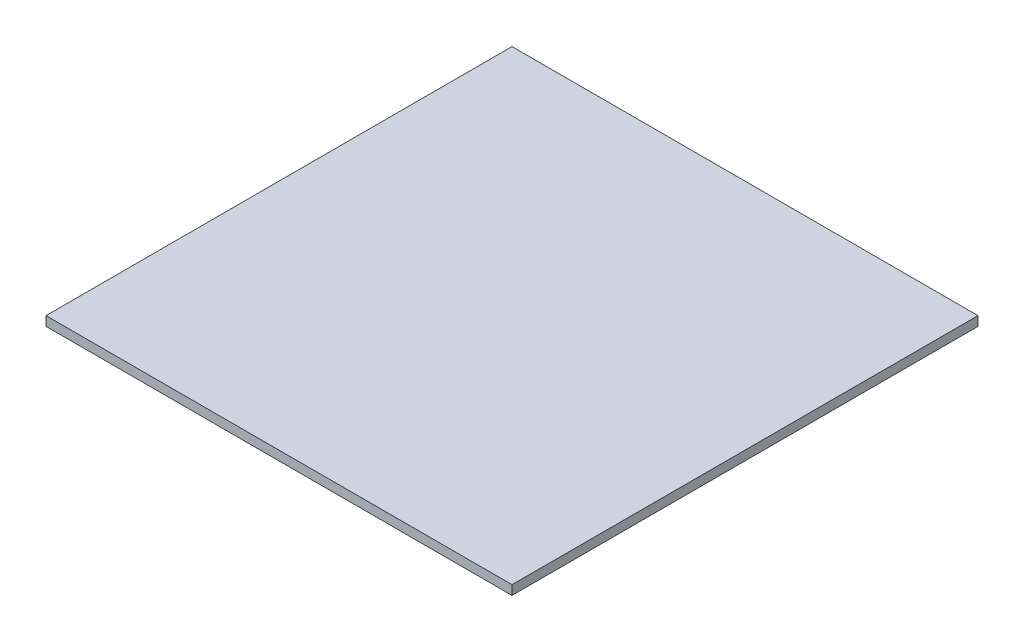
ISO-10303-21;
HEADER;
FILE_DESCRIPTION(('STEP AP214'),'2;1');
FILE_NAME('part.step','',(''),(''),'','','');
FILE_SCHEMA(('AUTOMOTIVE_DESIGN { 1 0 10303 214 1 1 1 1 }'));
ENDSEC;
DATA;
#1=APPLICATION_CONTEXT('core data for automotive mechanical design processes');
#2=APPLICATION_PROTOCOL_DEFINITION('international standard','automotive_design',2000,#1);
#3=PRODUCT_CONTEXT('',#1,'mechanical');
#4=PRODUCT('Part','Part','',(#3));
#5=PRODUCT_RELATED_PRODUCT_CATEGORY('part','',(#4));
#6=PRODUCT_DEFINITION_FORMATION('','',#4);
#7=PRODUCT_DEFINITION_CONTEXT('part definition',#1,'design');
#8=PRODUCT_DEFINITION('design','',#6,#7);
#9=PRODUCT_DEFINITION_SHAPE('','',#8);
#10=(LENGTH_UNIT() NAMED_UNIT(*) SI_UNIT(.MILLI.,.METRE.));
#11=(NAMED_UNIT(*) PLANE_ANGLE_UNIT() SI_UNIT($,.RADIAN.));
#12=(NAMED_UNIT(*) SI_UNIT($,.STERADIAN.) SOLID_ANGLE_UNIT());
#13=UNCERTAINTY_MEASURE_WITH_UNIT(LENGTH_MEASURE(1.E-05),#10,'distance_accuracy_value','');
#14=(GEOMETRIC_REPRESENTATION_CONTEXT(3) GLOBAL_UNCERTAINTY_ASSIGNED_CONTEXT((#13)) GLOBAL_UNIT_ASSIGNED_CONTEXT((#10,
#11,#12)) REPRESENTATION_CONTEXT('',''));
#15=CARTESIAN_POINT('',(0.,0.,0.));
#16=DIRECTION('',(0.,0.,1.));
#17=DIRECTION('',(1.,0.,0.));
#18=AXIS2_PLACEMENT_3D('',#15,#16,#17);
#19=CARTESIAN_POINT('',(50.,2.,-50.));
#20=DIRECTION('',(-1.,0.,0.));
#21=DIRECTION('',(0.,0.,1.));
#22=AXIS2_PLACEMENT_3D('',#19,#20,#21);
#23=PLANE('',#22);
#24=DIRECTION('',(0.,0.,-1.));
#25=VECTOR('',#24,1.);
#26=CARTESIAN_POINT('',(50.,0.,-50.));
#27=LINE('',#26,#25);
#28=CARTESIAN_POINT('',(50.,0.,50.));
#29=VERTEX_POINT('',#28);
#30=CARTESIAN_POINT('',(50.,0.,-50.));
#31=VERTEX_POINT('',#30);
#32=EDGE_CURVE('E96',#29,#31,#27,.T.);
#33=ORIENTED_EDGE('',*,*,#32,.T.);
#34=DIRECTION('',(0.,-1.,0.));
#35=VECTOR('',#34,1.);
#36=CARTESIAN_POINT('',(50.,2.,-50.));
#37=LINE('',#36,#35);
#38=CARTESIAN_POINT('',(50.,2.,-50.));
#39=VERTEX_POINT('',#38);
#40=EDGE_CURVE('E11',#39,#31,#37,.T.);
#41=ORIENTED_EDGE('',*,*,#40,.F.);
#42=DIRECTION('',(0.,0.,-1.));
#43=VECTOR('',#42,1.);
#44=CARTESIAN_POINT('',(50.,2.,-50.));
#45=LINE('',#44,#43);
#46=CARTESIAN_POINT('',(50.,2.,50.));
#47=VERTEX_POINT('',#46);
#48=EDGE_CURVE('E84',#47,#39,#45,.T.);
#49=ORIENTED_EDGE('',*,*,#48,.F.);
#50=DIRECTION('',(0.,-1.,0.));
#51=VECTOR('',#50,1.);
#52=CARTESIAN_POINT('',(50.,2.,50.));
#53=LINE('',#52,#51);
#54=EDGE_CURVE('E92',#47,#29,#53,.T.);
#55=ORIENTED_EDGE('',*,*,#54,.T.);
#56=EDGE_LOOP('',(#33,#41,#49,#55));
#57=FACE_BOUND('',#56,.T.);
#58=ADVANCED_FACE('F33',(#57),#23,.F.);
#59=CARTESIAN_POINT('',(-50.,2.,-50.));
#60=DIRECTION('',(0.,0.,1.));
#61=DIRECTION('',(1.,0.,0.));
#62=AXIS2_PLACEMENT_3D('',#59,#60,#61);
#63=PLANE('',#62);
#64=DIRECTION('',(-1.,0.,0.));
#65=VECTOR('',#64,1.);
#66=CARTESIAN_POINT('',(-50.,0.,-50.));
#67=LINE('',#66,#65);
#68=CARTESIAN_POINT('',(-50.,0.,-50.));
#69=VERTEX_POINT('',#68);
#70=EDGE_CURVE('E88',#31,#69,#67,.T.);
#71=ORIENTED_EDGE('',*,*,#70,.T.);
#72=DIRECTION('',(0.,-1.,0.));
#73=VECTOR('',#72,1.);
#74=CARTESIAN_POINT('',(-50.,2.,-50.));
#75=LINE('',#74,#73);
#76=CARTESIAN_POINT('',(-50.,2.,-50.));
#77=VERTEX_POINT('',#76);
#78=EDGE_CURVE('E41',#77,#69,#75,.T.);
#79=ORIENTED_EDGE('',*,*,#78,.F.);
#80=DIRECTION('',(-1.,0.,0.));
#81=VECTOR('',#80,1.);
#82=CARTESIAN_POINT('',(-50.,2.,-50.));
#83=LINE('',#82,#81);
#84=EDGE_CURVE('E79',#39,#77,#83,.T.);
#85=ORIENTED_EDGE('',*,*,#84,.F.);
#86=ORIENTED_EDGE('',*,*,#40,.T.);
#87=EDGE_LOOP('',(#71,#79,#85,#86));
#88=FACE_BOUND('',#87,.T.);
#89=ADVANCED_FACE('F87',(#88),#63,.F.);
#90=CARTESIAN_POINT('',(-50.,2.,-50.));
#91=DIRECTION('',(1.,0.,0.));
#92=DIRECTION('',(0.,0.,-1.));
#93=AXIS2_PLACEMENT_3D('',#90,#91,#92);
#94=PLANE('',#93);
#95=DIRECTION('',(0.,0.,1.));
#96=VECTOR('',#95,1.);
#97=CARTESIAN_POINT('',(-50.,0.,-50.));
#98=LINE('',#97,#96);
#99=CARTESIAN_POINT('',(-50.,0.,50.));
#100=VERTEX_POINT('',#99);
#101=EDGE_CURVE('E66',#69,#100,#98,.T.);
#102=ORIENTED_EDGE('',*,*,#101,.T.);
#103=DIRECTION('',(0.,-1.,0.));
#104=VECTOR('',#103,1.);
#105=CARTESIAN_POINT('',(-50.,2.,50.));
#106=LINE('',#105,#104);
#107=CARTESIAN_POINT('',(-50.,2.,50.));
#108=VERTEX_POINT('',#107);
#109=EDGE_CURVE('E89',#108,#100,#106,.T.);
#110=ORIENTED_EDGE('',*,*,#109,.F.);
#111=DIRECTION('',(0.,0.,1.));
#112=VECTOR('',#111,1.);
#113=CARTESIAN_POINT('',(-50.,2.,-50.));
#114=LINE('',#113,#112);
#115=EDGE_CURVE('E82',#77,#108,#114,.T.);
#116=ORIENTED_EDGE('',*,*,#115,.F.);
#117=ORIENTED_EDGE('',*,*,#78,.T.);
#118=EDGE_LOOP('',(#102,#110,#116,#117));
#119=FACE_BOUND('',#118,.T.);
#120=ADVANCED_FACE('F90',(#119),#94,.F.);
#121=CARTESIAN_POINT('',(-50.,2.,50.));
#122=DIRECTION('',(0.,0.,-1.));
#123=DIRECTION('',(-1.,0.,0.));
#124=AXIS2_PLACEMENT_3D('',#121,#122,#123);
#125=PLANE('',#124);
#126=DIRECTION('',(1.,0.,0.));
#127=VECTOR('',#126,1.);
#128=CARTESIAN_POINT('',(-50.,0.,50.));
#129=LINE('',#128,#127);
#130=EDGE_CURVE('E72',#100,#29,#129,.T.);
#131=ORIENTED_EDGE('',*,*,#130,.T.);
#132=ORIENTED_EDGE('',*,*,#54,.F.);
#133=DIRECTION('',(1.,0.,0.));
#134=VECTOR('',#133,1.);
#135=CARTESIAN_POINT('',(-50.,2.,50.));
#136=LINE('',#135,#134);
#137=EDGE_CURVE('E49',#108,#47,#136,.T.);
#138=ORIENTED_EDGE('',*,*,#137,.F.);
#139=ORIENTED_EDGE('',*,*,#109,.T.);
#140=EDGE_LOOP('',(#131,#132,#138,#139));
#141=FACE_BOUND('',#140,.T.);
#142=ADVANCED_FACE('F103',(#141),#125,.F.);
#143=CARTESIAN_POINT('',(0.,2.,0.));
#144=DIRECTION('',(0.,1.,0.));
#145=DIRECTION('',(0.,0.,1.));
#146=AXIS2_PLACEMENT_3D('',#143,#144,#145);
#147=PLANE('',#146);
#148=ORIENTED_EDGE('',*,*,#48,.T.);
#149=ORIENTED_EDGE('',*,*,#84,.T.);
#150=ORIENTED_EDGE('',*,*,#115,.T.);
#151=ORIENTED_EDGE('',*,*,#137,.T.);
#152=EDGE_LOOP('',(#148,#149,#150,#151));
#153=FACE_BOUND('',#152,.T.);
#154=ADVANCED_FACE('F80',(#153),#147,.T.);
#155=CARTESIAN_POINT('',(0.,0.,0.));
#156=DIRECTION('',(0.,1.,0.));
#157=DIRECTION('',(0.,0.,1.));
#158=AXIS2_PLACEMENT_3D('',#155,#156,#157);
#159=PLANE('',#158);
#160=ORIENTED_EDGE('',*,*,#32,.F.);
#161=ORIENTED_EDGE('',*,*,#130,.F.);
#162=ORIENTED_EDGE('',*,*,#101,.F.);
#163=ORIENTED_EDGE('',*,*,#70,.F.);
#164=EDGE_LOOP('',(#160,#161,#162,#163));
#165=FACE_BOUND('',#164,.T.);
#166=ADVANCED_FACE('F106',(#165),#159,.F.);
#167=CLOSED_SHELL('',(#58,#89,#120,#142,#154,#166));
#168=MANIFOLD_SOLID_BREP('B2',#167);
#169=ADVANCED_BREP_SHAPE_REPRESENTATION('',(#18,#168),#14);
#170=SHAPE_DEFINITION_REPRESENTATION(#9,#169);
ENDSEC;
END-ISO-10303-21;
